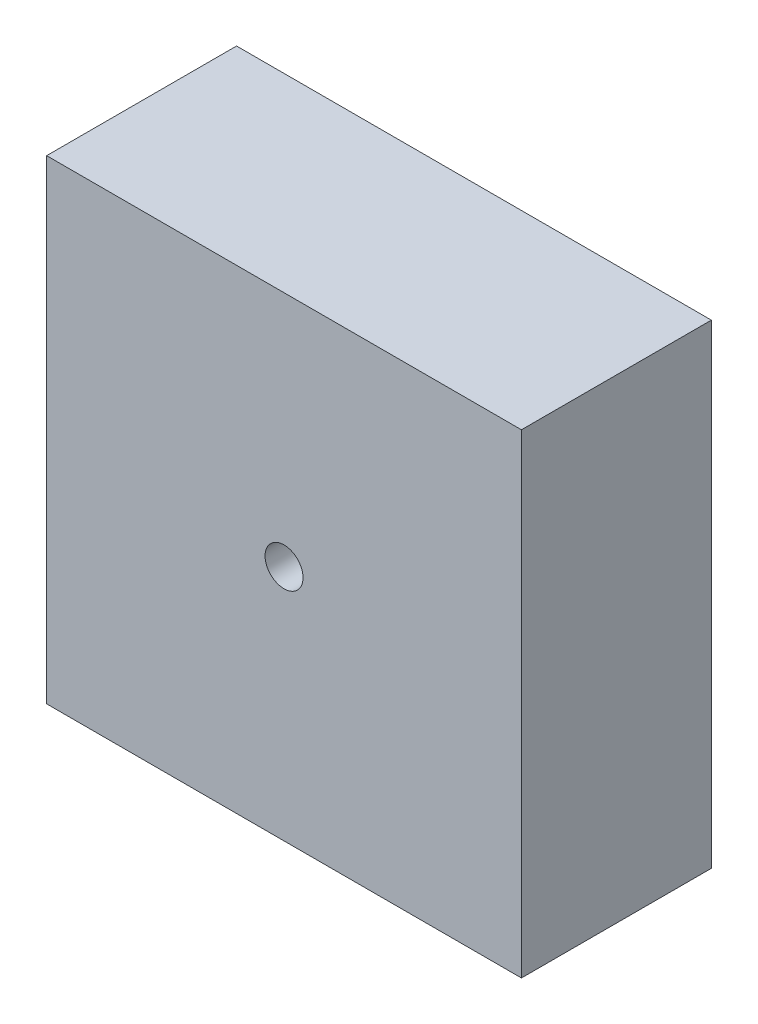
ISO-10303-21;
HEADER;
FILE_DESCRIPTION(('STEP AP214'),'2;1');
FILE_NAME('part.step','',(''),(''),'','','');
FILE_SCHEMA(('AUTOMOTIVE_DESIGN { 1 0 10303 214 1 1 1 1 }'));
ENDSEC;
DATA;
#1=APPLICATION_CONTEXT('core data for automotive mechanical design processes');
#2=APPLICATION_PROTOCOL_DEFINITION('international standard','automotive_design',2000,#1);
#3=PRODUCT_CONTEXT('',#1,'mechanical');
#4=PRODUCT('Part','Part','',(#3));
#5=PRODUCT_RELATED_PRODUCT_CATEGORY('part','',(#4));
#6=PRODUCT_DEFINITION_FORMATION('','',#4);
#7=PRODUCT_DEFINITION_CONTEXT('part definition',#1,'design');
#8=PRODUCT_DEFINITION('design','',#6,#7);
#9=PRODUCT_DEFINITION_SHAPE('','',#8);
#10=(LENGTH_UNIT() NAMED_UNIT(*) SI_UNIT(.MILLI.,.METRE.));
#11=(NAMED_UNIT(*) PLANE_ANGLE_UNIT() SI_UNIT($,.RADIAN.));
#12=(NAMED_UNIT(*) SI_UNIT($,.STERADIAN.) SOLID_ANGLE_UNIT());
#13=UNCERTAINTY_MEASURE_WITH_UNIT(LENGTH_MEASURE(1.E-05),#10,'distance_accuracy_value','');
#14=(GEOMETRIC_REPRESENTATION_CONTEXT(3) GLOBAL_UNCERTAINTY_ASSIGNED_CONTEXT((#13)) GLOBAL_UNIT_ASSIGNED_CONTEXT((#10,
#11,#12)) REPRESENTATION_CONTEXT('',''));
#15=CARTESIAN_POINT('',(0.,0.,0.));
#16=DIRECTION('',(0.,0.,1.));
#17=DIRECTION('',(1.,0.,0.));
#18=AXIS2_PLACEMENT_3D('',#15,#16,#17);
#19=CARTESIAN_POINT('',(0.,0.,20.));
#20=DIRECTION('',(0.,0.,1.));
#21=DIRECTION('',(1.,0.,0.));
#22=AXIS2_PLACEMENT_3D('',#19,#20,#21);
#23=PLANE('',#22);
#24=DIRECTION('',(0.,1.,0.));
#25=VECTOR('',#24,1.);
#26=CARTESIAN_POINT('',(25.,25.,20.));
#27=LINE('',#26,#25);
#28=CARTESIAN_POINT('',(25.,-25.,20.));
#29=VERTEX_POINT('',#28);
#30=CARTESIAN_POINT('',(25.,25.,20.));
#31=VERTEX_POINT('',#30);
#32=EDGE_CURVE('E86',#29,#31,#27,.T.);
#33=ORIENTED_EDGE('',*,*,#32,.T.);
#34=DIRECTION('',(-1.,0.,0.));
#35=VECTOR('',#34,1.);
#36=CARTESIAN_POINT('',(-25.,25.,20.));
#37=LINE('',#36,#35);
#38=CARTESIAN_POINT('',(-25.,25.,20.));
#39=VERTEX_POINT('',#38);
#40=EDGE_CURVE('E81',#31,#39,#37,.T.);
#41=ORIENTED_EDGE('',*,*,#40,.T.);
#42=DIRECTION('',(0.,-1.,0.));
#43=VECTOR('',#42,1.);
#44=CARTESIAN_POINT('',(-25.,25.,20.));
#45=LINE('',#44,#43);
#46=CARTESIAN_POINT('',(-25.,-25.,20.));
#47=VERTEX_POINT('',#46);
#48=EDGE_CURVE('E84',#39,#47,#45,.T.);
#49=ORIENTED_EDGE('',*,*,#48,.T.);
#50=DIRECTION('',(1.,0.,0.));
#51=VECTOR('',#50,1.);
#52=CARTESIAN_POINT('',(-25.,-25.,20.));
#53=LINE('',#52,#51);
#54=EDGE_CURVE('E51',#47,#29,#53,.T.);
#55=ORIENTED_EDGE('',*,*,#54,.T.);
#56=EDGE_LOOP('',(#33,#41,#49,#55));
#57=FACE_BOUND('',#56,.T.);
#58=CARTESIAN_POINT('',(0.,0.,20.));
#59=DIRECTION('',(0.,0.,1.));
#60=DIRECTION('',(1.,0.,0.));
#61=AXIS2_PLACEMENT_3D('',#58,#59,#60);
#62=CIRCLE('',#61,2.);
#63=CARTESIAN_POINT('',(1.99999999999999,0.,20.));
#64=VERTEX_POINT('',#63);
#65=EDGE_CURVE('E101',#64,#64,#62,.T.);
#66=ORIENTED_EDGE('',*,*,#65,.F.);
#67=EDGE_LOOP('',(#66));
#68=FACE_BOUND('',#67,.T.);
#69=ADVANCED_FACE('F34',(#57,#68),#23,.T.);
#70=CARTESIAN_POINT('',(0.,0.,0.));
#71=DIRECTION('',(0.,0.,1.));
#72=DIRECTION('',(1.,0.,0.));
#73=AXIS2_PLACEMENT_3D('',#70,#71,#72);
#74=PLANE('',#73);
#75=DIRECTION('',(0.,1.,0.));
#76=VECTOR('',#75,1.);
#77=CARTESIAN_POINT('',(25.,25.,0.));
#78=LINE('',#77,#76);
#79=CARTESIAN_POINT('',(25.,-25.,0.));
#80=VERTEX_POINT('',#79);
#81=CARTESIAN_POINT('',(25.,25.,0.));
#82=VERTEX_POINT('',#81);
#83=EDGE_CURVE('E98',#80,#82,#78,.T.);
#84=ORIENTED_EDGE('',*,*,#83,.F.);
#85=DIRECTION('',(1.,0.,0.));
#86=VECTOR('',#85,1.);
#87=CARTESIAN_POINT('',(-25.,-25.,0.));
#88=LINE('',#87,#86);
#89=CARTESIAN_POINT('',(-25.,-25.,0.));
#90=VERTEX_POINT('',#89);
#91=EDGE_CURVE('E74',#90,#80,#88,.T.);
#92=ORIENTED_EDGE('',*,*,#91,.F.);
#93=DIRECTION('',(0.,-1.,0.));
#94=VECTOR('',#93,1.);
#95=CARTESIAN_POINT('',(-25.,25.,0.));
#96=LINE('',#95,#94);
#97=CARTESIAN_POINT('',(-25.,25.,0.));
#98=VERTEX_POINT('',#97);
#99=EDGE_CURVE('E68',#98,#90,#96,.T.);
#100=ORIENTED_EDGE('',*,*,#99,.F.);
#101=DIRECTION('',(-1.,0.,0.));
#102=VECTOR('',#101,1.);
#103=CARTESIAN_POINT('',(-25.,25.,0.));
#104=LINE('',#103,#102);
#105=EDGE_CURVE('E90',#82,#98,#104,.T.);
#106=ORIENTED_EDGE('',*,*,#105,.F.);
#107=EDGE_LOOP('',(#84,#92,#100,#106));
#108=FACE_BOUND('',#107,.T.);
#109=CARTESIAN_POINT('',(0.,0.,0.));
#110=DIRECTION('',(0.,0.,1.));
#111=DIRECTION('',(1.,0.,0.));
#112=AXIS2_PLACEMENT_3D('',#109,#110,#111);
#113=CIRCLE('',#112,2.);
#114=CARTESIAN_POINT('',(1.99999999999999,0.,0.));
#115=VERTEX_POINT('',#114);
#116=EDGE_CURVE('E113',#115,#115,#113,.T.);
#117=ORIENTED_EDGE('',*,*,#116,.T.);
#118=EDGE_LOOP('',(#117));
#119=FACE_BOUND('',#118,.T.);
#120=ADVANCED_FACE('F109',(#108,#119),#74,.F.);
#121=CARTESIAN_POINT('',(25.,25.,20.));
#122=DIRECTION('',(-1.,0.,0.));
#123=DIRECTION('',(0.,-1.,0.));
#124=AXIS2_PLACEMENT_3D('',#121,#122,#123);
#125=PLANE('',#124);
#126=ORIENTED_EDGE('',*,*,#83,.T.);
#127=DIRECTION('',(0.,0.,-1.));
#128=VECTOR('',#127,1.);
#129=CARTESIAN_POINT('',(25.,25.,20.));
#130=LINE('',#129,#128);
#131=EDGE_CURVE('E11',#31,#82,#130,.T.);
#132=ORIENTED_EDGE('',*,*,#131,.F.);
#133=ORIENTED_EDGE('',*,*,#32,.F.);
#134=DIRECTION('',(0.,0.,-1.));
#135=VECTOR('',#134,1.);
#136=CARTESIAN_POINT('',(25.,-25.,20.));
#137=LINE('',#136,#135);
#138=EDGE_CURVE('E94',#29,#80,#137,.T.);
#139=ORIENTED_EDGE('',*,*,#138,.T.);
#140=EDGE_LOOP('',(#126,#132,#133,#139));
#141=FACE_BOUND('',#140,.T.);
#142=ADVANCED_FACE('F36',(#141),#125,.F.);
#143=CARTESIAN_POINT('',(-25.,25.,20.));
#144=DIRECTION('',(0.,-1.,0.));
#145=DIRECTION('',(0.,0.,-1.));
#146=AXIS2_PLACEMENT_3D('',#143,#144,#145);
#147=PLANE('',#146);
#148=ORIENTED_EDGE('',*,*,#105,.T.);
#149=DIRECTION('',(0.,0.,-1.));
#150=VECTOR('',#149,1.);
#151=CARTESIAN_POINT('',(-25.,25.,20.));
#152=LINE('',#151,#150);
#153=EDGE_CURVE('E43',#39,#98,#152,.T.);
#154=ORIENTED_EDGE('',*,*,#153,.F.);
#155=ORIENTED_EDGE('',*,*,#40,.F.);
#156=ORIENTED_EDGE('',*,*,#131,.T.);
#157=EDGE_LOOP('',(#148,#154,#155,#156));
#158=FACE_BOUND('',#157,.T.);
#159=ADVANCED_FACE('F89',(#158),#147,.F.);
#160=CARTESIAN_POINT('',(-25.,25.,20.));
#161=DIRECTION('',(1.,0.,0.));
#162=DIRECTION('',(0.,1.,0.));
#163=AXIS2_PLACEMENT_3D('',#160,#161,#162);
#164=PLANE('',#163);
#165=ORIENTED_EDGE('',*,*,#99,.T.);
#166=DIRECTION('',(0.,0.,-1.));
#167=VECTOR('',#166,1.);
#168=CARTESIAN_POINT('',(-25.,-25.,20.));
#169=LINE('',#168,#167);
#170=EDGE_CURVE('E91',#47,#90,#169,.T.);
#171=ORIENTED_EDGE('',*,*,#170,.F.);
#172=ORIENTED_EDGE('',*,*,#48,.F.);
#173=ORIENTED_EDGE('',*,*,#153,.T.);
#174=EDGE_LOOP('',(#165,#171,#172,#173));
#175=FACE_BOUND('',#174,.T.);
#176=ADVANCED_FACE('F92',(#175),#164,.F.);
#177=CARTESIAN_POINT('',(-25.,-25.,20.));
#178=DIRECTION('',(0.,1.,0.));
#179=DIRECTION('',(0.,0.,1.));
#180=AXIS2_PLACEMENT_3D('',#177,#178,#179);
#181=PLANE('',#180);
#182=ORIENTED_EDGE('',*,*,#91,.T.);
#183=ORIENTED_EDGE('',*,*,#138,.F.);
#184=ORIENTED_EDGE('',*,*,#54,.F.);
#185=ORIENTED_EDGE('',*,*,#170,.T.);
#186=EDGE_LOOP('',(#182,#183,#184,#185));
#187=FACE_BOUND('',#186,.T.);
#188=ADVANCED_FACE('F106',(#187),#181,.F.);
#189=CARTESIAN_POINT('',(0.,0.,20.));
#190=DIRECTION('',(0.,0.,-1.));
#191=DIRECTION('',(-1.,0.,0.));
#192=AXIS2_PLACEMENT_3D('',#189,#190,#191);
#193=CYLINDRICAL_SURFACE('',#192,2.);
#194=ORIENTED_EDGE('',*,*,#65,.T.);
#195=EDGE_LOOP('',(#194));
#196=FACE_BOUND('',#195,.T.);
#197=ORIENTED_EDGE('',*,*,#116,.F.);
#198=EDGE_LOOP('',(#197));
#199=FACE_BOUND('',#198,.T.);
#200=ADVANCED_FACE('F119',(#196,#199),#193,.F.);
#201=CLOSED_SHELL('',(#69,#120,#142,#159,#176,#188,#200));
#202=MANIFOLD_SOLID_BREP('B2',#201);
#203=ADVANCED_BREP_SHAPE_REPRESENTATION('',(#18,#202),#14);
#204=SHAPE_DEFINITION_REPRESENTATION(#9,#203);
ENDSEC;
END-ISO-10303-21;
